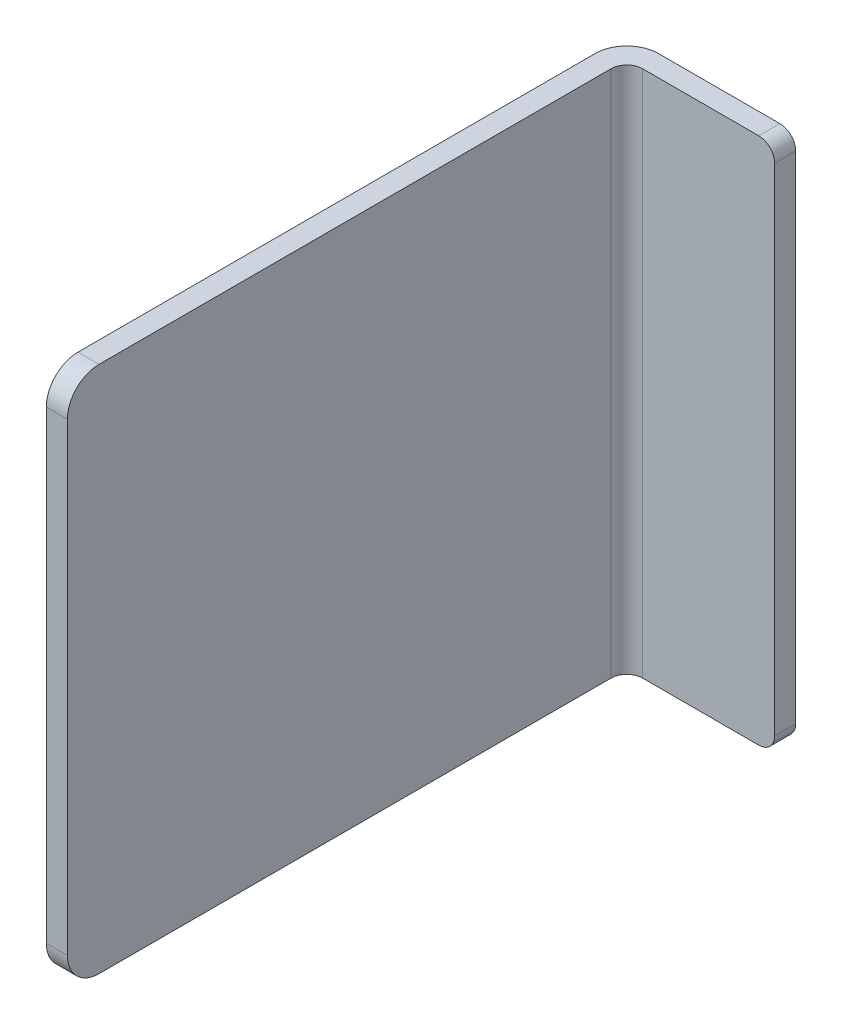
ISO-10303-21;
HEADER;
FILE_DESCRIPTION(('STEP AP214'),'2;1');
FILE_NAME('part.step','',(''),(''),'','','');
FILE_SCHEMA(('AUTOMOTIVE_DESIGN { 1 0 10303 214 1 1 1 1 }'));
ENDSEC;
DATA;
#1=APPLICATION_CONTEXT('core data for automotive mechanical design processes');
#2=APPLICATION_PROTOCOL_DEFINITION('international standard','automotive_design',2000,#1);
#3=PRODUCT_CONTEXT('',#1,'mechanical');
#4=PRODUCT('Part','Part','',(#3));
#5=PRODUCT_RELATED_PRODUCT_CATEGORY('part','',(#4));
#6=PRODUCT_DEFINITION_FORMATION('','',#4);
#7=PRODUCT_DEFINITION_CONTEXT('part definition',#1,'design');
#8=PRODUCT_DEFINITION('design','',#6,#7);
#9=PRODUCT_DEFINITION_SHAPE('','',#8);
#10=(LENGTH_UNIT() NAMED_UNIT(*) SI_UNIT(.MILLI.,.METRE.));
#11=(NAMED_UNIT(*) PLANE_ANGLE_UNIT() SI_UNIT($,.RADIAN.));
#12=(NAMED_UNIT(*) SI_UNIT($,.STERADIAN.) SOLID_ANGLE_UNIT());
#13=UNCERTAINTY_MEASURE_WITH_UNIT(LENGTH_MEASURE(1.E-05),#10,'distance_accuracy_value','');
#14=(GEOMETRIC_REPRESENTATION_CONTEXT(3) GLOBAL_UNCERTAINTY_ASSIGNED_CONTEXT((#13)) GLOBAL_UNIT_ASSIGNED_CONTEXT((#10,
#11,#12)) REPRESENTATION_CONTEXT('',''));
#15=CARTESIAN_POINT('',(0.,0.,0.));
#16=DIRECTION('',(0.,0.,1.));
#17=DIRECTION('',(1.,0.,0.));
#18=AXIS2_PLACEMENT_3D('',#15,#16,#17);
#19=CARTESIAN_POINT('',(-1.55,-2.35,-0.259638676242362));
#20=DIRECTION('',(0.,0.,1.));
#21=DIRECTION('',(0.707106781186548,-0.707106781186548,0.));
#22=AXIS2_PLACEMENT_3D('',#19,#20,#21);
#23=CYLINDRICAL_SURFACE('',#22,0.15);
#24=CARTESIAN_POINT('',(-1.55,-2.35,0.2));
#25=DIRECTION('',(0.,0.,-1.));
#26=DIRECTION('',(0.707106781186548,-0.707106781186548,0.));
#27=AXIS2_PLACEMENT_3D('',#24,#25,#26);
#28=CIRCLE('',#27,0.15);
#29=CARTESIAN_POINT('',(-1.4,-2.35,0.2));
#30=VERTEX_POINT('',#29);
#31=CARTESIAN_POINT('',(-1.55,-2.5,0.2));
#32=VERTEX_POINT('',#31);
#33=EDGE_CURVE('E11',#30,#32,#28,.T.);
#34=ORIENTED_EDGE('',*,*,#33,.T.);
#35=DIRECTION('',(0.,0.,-1.));
#36=VECTOR('',#35,1.);
#37=CARTESIAN_POINT('',(-1.55,-2.5,-0.259638676242362));
#38=LINE('',#37,#36);
#39=CARTESIAN_POINT('',(-1.55,-2.5,0.));
#40=VERTEX_POINT('',#39);
#41=EDGE_CURVE('E24',#32,#40,#38,.T.);
#42=ORIENTED_EDGE('',*,*,#41,.T.);
#43=CARTESIAN_POINT('',(-1.55,-2.35,0.));
#44=DIRECTION('',(0.,0.,1.));
#45=DIRECTION('',(0.707106781186548,-0.707106781186548,0.));
#46=AXIS2_PLACEMENT_3D('',#43,#44,#45);
#47=CIRCLE('',#46,0.15);
#48=CARTESIAN_POINT('',(-1.4,-2.35,0.));
#49=VERTEX_POINT('',#48);
#50=EDGE_CURVE('E200',#40,#49,#47,.T.);
#51=ORIENTED_EDGE('',*,*,#50,.T.);
#52=DIRECTION('',(0.,0.,1.));
#53=VECTOR('',#52,1.);
#54=CARTESIAN_POINT('',(-1.4,-2.35,-0.259638676242362));
#55=LINE('',#54,#53);
#56=EDGE_CURVE('E198',#49,#30,#55,.T.);
#57=ORIENTED_EDGE('',*,*,#56,.T.);
#58=EDGE_LOOP('',(#34,#42,#51,#57));
#59=FACE_BOUND('',#58,.T.);
#60=ADVANCED_FACE('F17',(#59),#23,.T.);
#61=CARTESIAN_POINT('',(-3.,-2.5,0.));
#62=DIRECTION('',(0.,-1.,0.));
#63=DIRECTION('',(1.,0.,0.));
#64=AXIS2_PLACEMENT_3D('',#61,#62,#63);
#65=PLANE('',#64);
#66=ORIENTED_EDGE('',*,*,#41,.F.);
#67=DIRECTION('',(-1.,0.,0.));
#68=VECTOR('',#67,1.);
#69=CARTESIAN_POINT('',(-2.9,-2.5,0.2));
#70=LINE('',#69,#68);
#71=CARTESIAN_POINT('',(-2.65,-2.5,0.2));
#72=VERTEX_POINT('',#71);
#73=EDGE_CURVE('E196',#32,#72,#70,.T.);
#74=ORIENTED_EDGE('',*,*,#73,.T.);
#75=CARTESIAN_POINT('',(-2.65,-2.5,0.35));
#76=DIRECTION('',(0.,-1.,0.));
#77=DIRECTION('',(-0.707106781186548,0.,-0.707106781186547));
#78=AXIS2_PLACEMENT_3D('',#75,#76,#77);
#79=CIRCLE('',#78,0.15);
#80=CARTESIAN_POINT('',(-2.8,-2.5,0.35));
#81=VERTEX_POINT('',#80);
#82=EDGE_CURVE('E193',#81,#72,#79,.T.);
#83=ORIENTED_EDGE('',*,*,#82,.F.);
#84=DIRECTION('',(0.,0.,1.));
#85=VECTOR('',#84,1.);
#86=CARTESIAN_POINT('',(-2.8,-2.5,2.70725182445));
#87=LINE('',#86,#85);
#88=CARTESIAN_POINT('',(-2.8,-2.5,5.2));
#89=VERTEX_POINT('',#88);
#90=EDGE_CURVE('E191',#81,#89,#87,.T.);
#91=ORIENTED_EDGE('',*,*,#90,.T.);
#92=DIRECTION('',(1.,0.,0.));
#93=VECTOR('',#92,1.);
#94=CARTESIAN_POINT('',(-1.5,-2.5,5.2));
#95=LINE('',#94,#93);
#96=CARTESIAN_POINT('',(-3.,-2.5,5.2));
#97=VERTEX_POINT('',#96);
#98=EDGE_CURVE('E189',#97,#89,#95,.T.);
#99=ORIENTED_EDGE('',*,*,#98,.F.);
#100=DIRECTION('',(0.,0.,1.));
#101=VECTOR('',#100,1.);
#102=CARTESIAN_POINT('',(-3.,-2.5,0.));
#103=LINE('',#102,#101);
#104=CARTESIAN_POINT('',(-3.,-2.5,0.3));
#105=VERTEX_POINT('',#104);
#106=EDGE_CURVE('E126',#105,#97,#103,.T.);
#107=ORIENTED_EDGE('',*,*,#106,.F.);
#108=CARTESIAN_POINT('',(-2.7,-2.5,0.3));
#109=DIRECTION('',(0.,1.,0.));
#110=DIRECTION('',(-0.707106781186548,0.,-0.707106781186547));
#111=AXIS2_PLACEMENT_3D('',#108,#109,#110);
#112=CIRCLE('',#111,0.3);
#113=CARTESIAN_POINT('',(-2.7,-2.5,0.));
#114=VERTEX_POINT('',#113);
#115=EDGE_CURVE('E185',#114,#105,#112,.T.);
#116=ORIENTED_EDGE('',*,*,#115,.F.);
#117=DIRECTION('',(1.,0.,0.));
#118=VECTOR('',#117,1.);
#119=CARTESIAN_POINT('',(-3.,-2.5,0.));
#120=LINE('',#119,#118);
#121=EDGE_CURVE('E182',#114,#40,#120,.T.);
#122=ORIENTED_EDGE('',*,*,#121,.T.);
#123=EDGE_LOOP('',(#66,#74,#83,#91,#99,#107,#116,#122));
#124=FACE_BOUND('',#123,.T.);
#125=ADVANCED_FACE('F210',(#124),#65,.T.);
#126=CARTESIAN_POINT('',(-2.8,2.5,0.2));
#127=DIRECTION('',(0.,0.,-1.));
#128=DIRECTION('',(1.,0.,0.));
#129=AXIS2_PLACEMENT_3D('',#126,#127,#128);
#130=PLANE('',#129);
#131=ORIENTED_EDGE('',*,*,#33,.F.);
#132=DIRECTION('',(0.,1.,0.));
#133=VECTOR('',#132,1.);
#134=CARTESIAN_POINT('',(-1.4,2.5,0.2));
#135=LINE('',#134,#133);
#136=CARTESIAN_POINT('',(-1.4,2.35,0.2));
#137=VERTEX_POINT('',#136);
#138=EDGE_CURVE('E180',#30,#137,#135,.T.);
#139=ORIENTED_EDGE('',*,*,#138,.T.);
#140=CARTESIAN_POINT('',(-1.55,2.35,0.2));
#141=DIRECTION('',(0.,0.,-1.));
#142=DIRECTION('',(0.707106781186548,0.707106781186548,0.));
#143=AXIS2_PLACEMENT_3D('',#140,#141,#142);
#144=CIRCLE('',#143,0.15);
#145=CARTESIAN_POINT('',(-1.55,2.5,0.2));
#146=VERTEX_POINT('',#145);
#147=EDGE_CURVE('E177',#146,#137,#144,.T.);
#148=ORIENTED_EDGE('',*,*,#147,.F.);
#149=DIRECTION('',(1.,0.,0.));
#150=VECTOR('',#149,1.);
#151=CARTESIAN_POINT('',(0.1,2.5,0.2));
#152=LINE('',#151,#150);
#153=CARTESIAN_POINT('',(-2.65,2.5,0.2));
#154=VERTEX_POINT('',#153);
#155=EDGE_CURVE('E174',#154,#146,#152,.T.);
#156=ORIENTED_EDGE('',*,*,#155,.F.);
#157=DIRECTION('',(0.,1.,0.));
#158=VECTOR('',#157,1.);
#159=CARTESIAN_POINT('',(-2.65,2.5,0.2));
#160=LINE('',#159,#158);
#161=EDGE_CURVE('E171',#72,#154,#160,.T.);
#162=ORIENTED_EDGE('',*,*,#161,.F.);
#163=ORIENTED_EDGE('',*,*,#73,.F.);
#164=EDGE_LOOP('',(#131,#139,#148,#156,#162,#163));
#165=FACE_BOUND('',#164,.T.);
#166=ADVANCED_FACE('F228',(#165),#130,.F.);
#167=CARTESIAN_POINT('',(-1.55,2.35,-0.259638676242362));
#168=DIRECTION('',(0.,0.,-1.));
#169=DIRECTION('',(0.707106781186548,0.707106781186548,0.));
#170=AXIS2_PLACEMENT_3D('',#167,#168,#169);
#171=CYLINDRICAL_SURFACE('',#170,0.15);
#172=CARTESIAN_POINT('',(-1.55,2.35,0.));
#173=DIRECTION('',(0.,0.,1.));
#174=DIRECTION('',(0.707106781186548,0.707106781186548,0.));
#175=AXIS2_PLACEMENT_3D('',#172,#173,#174);
#176=CIRCLE('',#175,0.15);
#177=CARTESIAN_POINT('',(-1.4,2.35,0.));
#178=VERTEX_POINT('',#177);
#179=CARTESIAN_POINT('',(-1.55,2.5,0.));
#180=VERTEX_POINT('',#179);
#181=EDGE_CURVE('E169',#178,#180,#176,.T.);
#182=ORIENTED_EDGE('',*,*,#181,.T.);
#183=DIRECTION('',(0.,0.,1.));
#184=VECTOR('',#183,1.);
#185=CARTESIAN_POINT('',(-1.55,2.5,-0.259638676242362));
#186=LINE('',#185,#184);
#187=EDGE_CURVE('E166',#180,#146,#186,.T.);
#188=ORIENTED_EDGE('',*,*,#187,.T.);
#189=ORIENTED_EDGE('',*,*,#147,.T.);
#190=DIRECTION('',(0.,0.,-1.));
#191=VECTOR('',#190,1.);
#192=CARTESIAN_POINT('',(-1.4,2.35,-0.259638676242362));
#193=LINE('',#192,#191);
#194=EDGE_CURVE('E163',#137,#178,#193,.T.);
#195=ORIENTED_EDGE('',*,*,#194,.T.);
#196=EDGE_LOOP('',(#182,#188,#189,#195));
#197=FACE_BOUND('',#196,.T.);
#198=ADVANCED_FACE('F231',(#197),#171,.T.);
#199=CARTESIAN_POINT('',(3.,2.5,0.));
#200=DIRECTION('',(0.,1.,0.));
#201=DIRECTION('',(-1.,0.,0.));
#202=AXIS2_PLACEMENT_3D('',#199,#200,#201);
#203=PLANE('',#202);
#204=ORIENTED_EDGE('',*,*,#187,.F.);
#205=DIRECTION('',(-1.,0.,0.));
#206=VECTOR('',#205,1.);
#207=CARTESIAN_POINT('',(3.,2.5,0.));
#208=LINE('',#207,#206);
#209=CARTESIAN_POINT('',(-2.7,2.5,0.));
#210=VERTEX_POINT('',#209);
#211=EDGE_CURVE('E161',#180,#210,#208,.T.);
#212=ORIENTED_EDGE('',*,*,#211,.T.);
#213=CARTESIAN_POINT('',(-2.7,2.5,0.3));
#214=DIRECTION('',(0.,-1.,0.));
#215=DIRECTION('',(-0.707106781186548,0.,-0.707106781186547));
#216=AXIS2_PLACEMENT_3D('',#213,#214,#215);
#217=CIRCLE('',#216,0.3);
#218=CARTESIAN_POINT('',(-3.,2.5,0.3));
#219=VERTEX_POINT('',#218);
#220=EDGE_CURVE('E158',#219,#210,#217,.T.);
#221=ORIENTED_EDGE('',*,*,#220,.F.);
#222=DIRECTION('',(0.,0.,1.));
#223=VECTOR('',#222,1.);
#224=CARTESIAN_POINT('',(-3.,2.5,0.));
#225=LINE('',#224,#223);
#226=CARTESIAN_POINT('',(-3.,2.5,5.2));
#227=VERTEX_POINT('',#226);
#228=EDGE_CURVE('E156',#219,#227,#225,.T.);
#229=ORIENTED_EDGE('',*,*,#228,.T.);
#230=DIRECTION('',(-1.,0.,0.));
#231=VECTOR('',#230,1.);
#232=CARTESIAN_POINT('',(1.5,2.5,5.2));
#233=LINE('',#232,#231);
#234=CARTESIAN_POINT('',(-2.8,2.5,5.2));
#235=VERTEX_POINT('',#234);
#236=EDGE_CURVE('E153',#235,#227,#233,.T.);
#237=ORIENTED_EDGE('',*,*,#236,.F.);
#238=DIRECTION('',(0.,0.,-1.));
#239=VECTOR('',#238,1.);
#240=CARTESIAN_POINT('',(-2.8,2.5,2.70725182445));
#241=LINE('',#240,#239);
#242=CARTESIAN_POINT('',(-2.8,2.5,0.35));
#243=VERTEX_POINT('',#242);
#244=EDGE_CURVE('E151',#235,#243,#241,.T.);
#245=ORIENTED_EDGE('',*,*,#244,.T.);
#246=CARTESIAN_POINT('',(-2.65,2.5,0.35));
#247=DIRECTION('',(0.,1.,0.));
#248=DIRECTION('',(-0.707106781186548,0.,-0.707106781186547));
#249=AXIS2_PLACEMENT_3D('',#246,#247,#248);
#250=CIRCLE('',#249,0.15);
#251=EDGE_CURVE('E148',#154,#243,#250,.T.);
#252=ORIENTED_EDGE('',*,*,#251,.F.);
#253=ORIENTED_EDGE('',*,*,#155,.T.);
#254=EDGE_LOOP('',(#204,#212,#221,#229,#237,#245,#252,#253));
#255=FACE_BOUND('',#254,.T.);
#256=ADVANCED_FACE('F216',(#255),#203,.T.);
#257=CARTESIAN_POINT('',(-2.65,2.5,0.35));
#258=DIRECTION('',(0.,-1.,0.));
#259=DIRECTION('',(-0.707106781186548,0.,-0.707106781186547));
#260=AXIS2_PLACEMENT_3D('',#257,#258,#259);
#261=CYLINDRICAL_SURFACE('',#260,0.15);
#262=ORIENTED_EDGE('',*,*,#251,.T.);
#263=DIRECTION('',(0.,-1.,0.));
#264=VECTOR('',#263,1.);
#265=CARTESIAN_POINT('',(-2.8,2.5,0.35));
#266=LINE('',#265,#264);
#267=EDGE_CURVE('E145',#243,#81,#266,.T.);
#268=ORIENTED_EDGE('',*,*,#267,.T.);
#269=ORIENTED_EDGE('',*,*,#82,.T.);
#270=ORIENTED_EDGE('',*,*,#161,.T.);
#271=EDGE_LOOP('',(#262,#268,#269,#270));
#272=FACE_BOUND('',#271,.T.);
#273=ADVANCED_FACE('F226',(#272),#261,.F.);
#274=CARTESIAN_POINT('',(-2.8,2.5,1.5));
#275=DIRECTION('',(-1.,0.,0.));
#276=DIRECTION('',(0.,0.,-1.));
#277=AXIS2_PLACEMENT_3D('',#274,#275,#276);
#278=PLANE('',#277);
#279=ORIENTED_EDGE('',*,*,#267,.F.);
#280=ORIENTED_EDGE('',*,*,#244,.F.);
#281=CARTESIAN_POINT('',(-2.8,2.2,5.2));
#282=DIRECTION('',(-1.,0.,0.));
#283=DIRECTION('',(0.,0.707106781186547,0.707106781186548));
#284=AXIS2_PLACEMENT_3D('',#281,#282,#283);
#285=CIRCLE('',#284,0.3);
#286=CARTESIAN_POINT('',(-2.8,2.2,5.5));
#287=VERTEX_POINT('',#286);
#288=EDGE_CURVE('E142',#287,#235,#285,.T.);
#289=ORIENTED_EDGE('',*,*,#288,.F.);
#290=DIRECTION('',(0.,1.,0.));
#291=VECTOR('',#290,1.);
#292=CARTESIAN_POINT('',(-2.8,1.25,5.5));
#293=LINE('',#292,#291);
#294=CARTESIAN_POINT('',(-2.8,-2.2,5.5));
#295=VERTEX_POINT('',#294);
#296=EDGE_CURVE('E140',#295,#287,#293,.T.);
#297=ORIENTED_EDGE('',*,*,#296,.F.);
#298=CARTESIAN_POINT('',(-2.8,-2.2,5.2));
#299=DIRECTION('',(-1.,0.,0.));
#300=DIRECTION('',(0.,-0.707106781186547,0.707106781186548));
#301=AXIS2_PLACEMENT_3D('',#298,#299,#300);
#302=CIRCLE('',#301,0.3);
#303=EDGE_CURVE('E120',#89,#295,#302,.T.);
#304=ORIENTED_EDGE('',*,*,#303,.F.);
#305=ORIENTED_EDGE('',*,*,#90,.F.);
#306=EDGE_LOOP('',(#279,#280,#289,#297,#304,#305));
#307=FACE_BOUND('',#306,.T.);
#308=ADVANCED_FACE('F222',(#307),#278,.F.);
#309=CARTESIAN_POINT('',(1.5,2.2,5.2));
#310=DIRECTION('',(-1.,0.,0.));
#311=DIRECTION('',(0.,0.707106781186547,0.707106781186548));
#312=AXIS2_PLACEMENT_3D('',#309,#310,#311);
#313=CYLINDRICAL_SURFACE('',#312,0.3);
#314=CARTESIAN_POINT('',(-3.,2.2,5.2));
#315=DIRECTION('',(1.,0.,0.));
#316=DIRECTION('',(0.,0.707106781186547,0.707106781186548));
#317=AXIS2_PLACEMENT_3D('',#314,#315,#316);
#318=CIRCLE('',#317,0.3);
#319=CARTESIAN_POINT('',(-3.,2.2,5.5));
#320=VERTEX_POINT('',#319);
#321=EDGE_CURVE('E137',#227,#320,#318,.T.);
#322=ORIENTED_EDGE('',*,*,#321,.T.);
#323=DIRECTION('',(1.,0.,0.));
#324=VECTOR('',#323,1.);
#325=CARTESIAN_POINT('',(1.5,2.2,5.5));
#326=LINE('',#325,#324);
#327=EDGE_CURVE('E108',#320,#287,#326,.T.);
#328=ORIENTED_EDGE('',*,*,#327,.T.);
#329=ORIENTED_EDGE('',*,*,#288,.T.);
#330=ORIENTED_EDGE('',*,*,#236,.T.);
#331=EDGE_LOOP('',(#322,#328,#329,#330));
#332=FACE_BOUND('',#331,.T.);
#333=ADVANCED_FACE('F219',(#332),#313,.T.);
#334=CARTESIAN_POINT('',(0.,0.,5.5));
#335=DIRECTION('',(0.,0.,1.));
#336=DIRECTION('',(1.,0.,0.));
#337=AXIS2_PLACEMENT_3D('',#334,#335,#336);
#338=PLANE('',#337);
#339=ORIENTED_EDGE('',*,*,#327,.F.);
#340=DIRECTION('',(0.,-1.,0.));
#341=VECTOR('',#340,1.);
#342=CARTESIAN_POINT('',(-3.,2.5,5.5));
#343=LINE('',#342,#341);
#344=CARTESIAN_POINT('',(-3.,-2.2,5.5));
#345=VERTEX_POINT('',#344);
#346=EDGE_CURVE('E102',#320,#345,#343,.T.);
#347=ORIENTED_EDGE('',*,*,#346,.T.);
#348=DIRECTION('',(-1.,0.,0.));
#349=VECTOR('',#348,1.);
#350=CARTESIAN_POINT('',(-1.5,-2.2,5.5));
#351=LINE('',#350,#349);
#352=EDGE_CURVE('E106',#295,#345,#351,.T.);
#353=ORIENTED_EDGE('',*,*,#352,.F.);
#354=ORIENTED_EDGE('',*,*,#296,.T.);
#355=EDGE_LOOP('',(#339,#347,#353,#354));
#356=FACE_BOUND('',#355,.T.);
#357=ADVANCED_FACE('F104',(#356),#338,.T.);
#358=CARTESIAN_POINT('',(-3.,2.5,0.));
#359=DIRECTION('',(-1.,0.,0.));
#360=DIRECTION('',(0.,-1.,0.));
#361=AXIS2_PLACEMENT_3D('',#358,#359,#360);
#362=PLANE('',#361);
#363=ORIENTED_EDGE('',*,*,#321,.F.);
#364=ORIENTED_EDGE('',*,*,#228,.F.);
#365=DIRECTION('',(0.,1.,0.));
#366=VECTOR('',#365,1.);
#367=CARTESIAN_POINT('',(-3.,1.25,0.3));
#368=LINE('',#367,#366);
#369=EDGE_CURVE('E121',#105,#219,#368,.T.);
#370=ORIENTED_EDGE('',*,*,#369,.F.);
#371=ORIENTED_EDGE('',*,*,#106,.T.);
#372=CARTESIAN_POINT('',(-3.,-2.2,5.2));
#373=DIRECTION('',(1.,0.,0.));
#374=DIRECTION('',(0.,-0.707106781186547,0.707106781186548));
#375=AXIS2_PLACEMENT_3D('',#372,#373,#374);
#376=CIRCLE('',#375,0.3);
#377=EDGE_CURVE('E118',#345,#97,#376,.T.);
#378=ORIENTED_EDGE('',*,*,#377,.F.);
#379=ORIENTED_EDGE('',*,*,#346,.F.);
#380=EDGE_LOOP('',(#363,#364,#370,#371,#378,#379));
#381=FACE_BOUND('',#380,.T.);
#382=ADVANCED_FACE('F124',(#381),#362,.T.);
#383=CARTESIAN_POINT('',(-1.5,-2.2,5.2));
#384=DIRECTION('',(1.,0.,0.));
#385=DIRECTION('',(0.,-0.707106781186547,0.707106781186548));
#386=AXIS2_PLACEMENT_3D('',#383,#384,#385);
#387=CYLINDRICAL_SURFACE('',#386,0.3);
#388=ORIENTED_EDGE('',*,*,#303,.T.);
#389=ORIENTED_EDGE('',*,*,#352,.T.);
#390=ORIENTED_EDGE('',*,*,#377,.T.);
#391=ORIENTED_EDGE('',*,*,#98,.T.);
#392=EDGE_LOOP('',(#388,#389,#390,#391));
#393=FACE_BOUND('',#392,.T.);
#394=ADVANCED_FACE('F116',(#393),#387,.T.);
#395=CARTESIAN_POINT('',(-2.7,1.25,0.3));
#396=DIRECTION('',(0.,-1.,0.));
#397=DIRECTION('',(-0.707106781186548,0.,-0.707106781186547));
#398=AXIS2_PLACEMENT_3D('',#395,#396,#397);
#399=CYLINDRICAL_SURFACE('',#398,0.3);
#400=ORIENTED_EDGE('',*,*,#115,.T.);
#401=ORIENTED_EDGE('',*,*,#369,.T.);
#402=ORIENTED_EDGE('',*,*,#220,.T.);
#403=DIRECTION('',(0.,-1.,0.));
#404=VECTOR('',#403,1.);
#405=CARTESIAN_POINT('',(-2.7,1.25,0.));
#406=LINE('',#405,#404);
#407=EDGE_CURVE('E127',#210,#114,#406,.T.);
#408=ORIENTED_EDGE('',*,*,#407,.T.);
#409=EDGE_LOOP('',(#400,#401,#402,#408));
#410=FACE_BOUND('',#409,.T.);
#411=ADVANCED_FACE('F212',(#410),#399,.T.);
#412=CARTESIAN_POINT('',(0.,0.,0.));
#413=DIRECTION('',(0.,0.,1.));
#414=DIRECTION('',(1.,0.,0.));
#415=AXIS2_PLACEMENT_3D('',#412,#413,#414);
#416=PLANE('',#415);
#417=ORIENTED_EDGE('',*,*,#50,.F.);
#418=ORIENTED_EDGE('',*,*,#121,.F.);
#419=ORIENTED_EDGE('',*,*,#407,.F.);
#420=ORIENTED_EDGE('',*,*,#211,.F.);
#421=ORIENTED_EDGE('',*,*,#181,.F.);
#422=DIRECTION('',(0.,-1.,0.));
#423=VECTOR('',#422,1.);
#424=CARTESIAN_POINT('',(-1.4,1.25,0.));
#425=LINE('',#424,#423);
#426=EDGE_CURVE('E132',#178,#49,#425,.T.);
#427=ORIENTED_EDGE('',*,*,#426,.T.);
#428=EDGE_LOOP('',(#417,#418,#419,#420,#421,#427));
#429=FACE_BOUND('',#428,.T.);
#430=ADVANCED_FACE('F207',(#429),#416,.F.);
#431=CARTESIAN_POINT('',(-1.4,2.5,-0.519277352484725));
#432=DIRECTION('',(-1.,0.,0.));
#433=DIRECTION('',(0.,0.,1.));
#434=AXIS2_PLACEMENT_3D('',#431,#432,#433);
#435=PLANE('',#434);
#436=ORIENTED_EDGE('',*,*,#56,.F.);
#437=ORIENTED_EDGE('',*,*,#426,.F.);
#438=ORIENTED_EDGE('',*,*,#194,.F.);
#439=ORIENTED_EDGE('',*,*,#138,.F.);
#440=EDGE_LOOP('',(#436,#437,#438,#439));
#441=FACE_BOUND('',#440,.T.);
#442=ADVANCED_FACE('F235',(#441),#435,.F.);
#443=CLOSED_SHELL('',(#60,#125,#166,#198,#256,#273,#308,#333,#357,#382,#394,#411,#430,#442));
#444=MANIFOLD_SOLID_BREP('B1',#443);
#445=ADVANCED_BREP_SHAPE_REPRESENTATION('',(#18,#444),#14);
#446=SHAPE_DEFINITION_REPRESENTATION(#9,#445);
ENDSEC;
END-ISO-10303-21;
